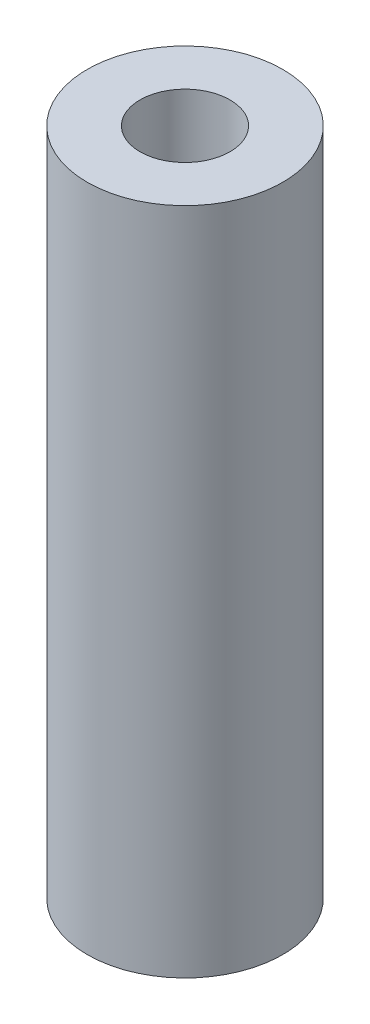
ISO-10303-21;
HEADER;
FILE_DESCRIPTION(('STEP AP214'),'2;1');
FILE_NAME('part.step','',(''),(''),'','','');
FILE_SCHEMA(('AUTOMOTIVE_DESIGN { 1 0 10303 214 1 1 1 1 }'));
ENDSEC;
DATA;
#1=APPLICATION_CONTEXT('core data for automotive mechanical design processes');
#2=APPLICATION_PROTOCOL_DEFINITION('international standard','automotive_design',2000,#1);
#3=PRODUCT_CONTEXT('',#1,'mechanical');
#4=PRODUCT('Part','Part','',(#3));
#5=PRODUCT_RELATED_PRODUCT_CATEGORY('part','',(#4));
#6=PRODUCT_DEFINITION_FORMATION('','',#4);
#7=PRODUCT_DEFINITION_CONTEXT('part definition',#1,'design');
#8=PRODUCT_DEFINITION('design','',#6,#7);
#9=PRODUCT_DEFINITION_SHAPE('','',#8);
#10=(LENGTH_UNIT() NAMED_UNIT(*) SI_UNIT(.MILLI.,.METRE.));
#11=(NAMED_UNIT(*) PLANE_ANGLE_UNIT() SI_UNIT($,.RADIAN.));
#12=(NAMED_UNIT(*) SI_UNIT($,.STERADIAN.) SOLID_ANGLE_UNIT());
#13=UNCERTAINTY_MEASURE_WITH_UNIT(LENGTH_MEASURE(1.E-05),#10,'distance_accuracy_value','');
#14=(GEOMETRIC_REPRESENTATION_CONTEXT(3) GLOBAL_UNCERTAINTY_ASSIGNED_CONTEXT((#13)) GLOBAL_UNIT_ASSIGNED_CONTEXT((#10,
#11,#12)) REPRESENTATION_CONTEXT('',''));
#15=CARTESIAN_POINT('',(0.,0.,0.));
#16=DIRECTION('',(0.,0.,1.));
#17=DIRECTION('',(1.,0.,0.));
#18=AXIS2_PLACEMENT_3D('',#15,#16,#17);
#19=CARTESIAN_POINT('',(0.,34.2,0.));
#20=DIRECTION('',(0.,1.,0.));
#21=DIRECTION('',(0.,0.,1.));
#22=AXIS2_PLACEMENT_3D('',#19,#20,#21);
#23=PLANE('',#22);
#24=CARTESIAN_POINT('',(0.,34.2,0.));
#25=DIRECTION('',(0.,1.,0.));
#26=DIRECTION('',(0.,0.,1.));
#27=AXIS2_PLACEMENT_3D('',#24,#25,#26);
#28=CIRCLE('',#27,5.);
#29=CARTESIAN_POINT('',(0.,34.2,5.));
#30=VERTEX_POINT('',#29);
#31=EDGE_CURVE('E10',#30,#30,#28,.T.);
#32=ORIENTED_EDGE('',*,*,#31,.T.);
#33=EDGE_LOOP('',(#32));
#34=FACE_BOUND('',#33,.T.);
#35=CARTESIAN_POINT('',(0.,34.2,0.));
#36=DIRECTION('',(0.,1.,0.));
#37=DIRECTION('',(0.,0.,1.));
#38=AXIS2_PLACEMENT_3D('',#35,#36,#37);
#39=CIRCLE('',#38,2.3);
#40=CARTESIAN_POINT('',(0.,34.2,2.3));
#41=VERTEX_POINT('',#40);
#42=EDGE_CURVE('E44',#41,#41,#39,.T.);
#43=ORIENTED_EDGE('',*,*,#42,.F.);
#44=EDGE_LOOP('',(#43));
#45=FACE_BOUND('',#44,.T.);
#46=ADVANCED_FACE('F33',(#34,#45),#23,.T.);
#47=CARTESIAN_POINT('',(0.,0.,0.));
#48=DIRECTION('',(0.,1.,0.));
#49=DIRECTION('',(0.,0.,1.));
#50=AXIS2_PLACEMENT_3D('',#47,#48,#49);
#51=PLANE('',#50);
#52=CARTESIAN_POINT('',(0.,0.,0.));
#53=DIRECTION('',(0.,1.,0.));
#54=DIRECTION('',(0.,0.,1.));
#55=AXIS2_PLACEMENT_3D('',#52,#53,#54);
#56=CIRCLE('',#55,5.);
#57=CARTESIAN_POINT('',(0.,0.,5.));
#58=VERTEX_POINT('',#57);
#59=EDGE_CURVE('E37',#58,#58,#56,.T.);
#60=ORIENTED_EDGE('',*,*,#59,.F.);
#61=EDGE_LOOP('',(#60));
#62=FACE_BOUND('',#61,.T.);
#63=CARTESIAN_POINT('',(0.,0.,0.));
#64=DIRECTION('',(0.,1.,0.));
#65=DIRECTION('',(0.,0.,1.));
#66=AXIS2_PLACEMENT_3D('',#63,#64,#65);
#67=CIRCLE('',#66,2.3);
#68=CARTESIAN_POINT('',(0.,0.,2.3));
#69=VERTEX_POINT('',#68);
#70=EDGE_CURVE('E46',#69,#69,#67,.T.);
#71=ORIENTED_EDGE('',*,*,#70,.T.);
#72=EDGE_LOOP('',(#71));
#73=FACE_BOUND('',#72,.T.);
#74=ADVANCED_FACE('F56',(#62,#73),#51,.F.);
#75=CARTESIAN_POINT('',(0.,34.2,0.));
#76=DIRECTION('',(0.,-1.,0.));
#77=DIRECTION('',(0.,0.,-1.));
#78=AXIS2_PLACEMENT_3D('',#75,#76,#77);
#79=CYLINDRICAL_SURFACE('',#78,5.);
#80=ORIENTED_EDGE('',*,*,#31,.F.);
#81=EDGE_LOOP('',(#80));
#82=FACE_BOUND('',#81,.T.);
#83=ORIENTED_EDGE('',*,*,#59,.T.);
#84=EDGE_LOOP('',(#83));
#85=FACE_BOUND('',#84,.T.);
#86=ADVANCED_FACE('F35',(#82,#85),#79,.T.);
#87=CARTESIAN_POINT('',(0.,34.2,0.));
#88=DIRECTION('',(0.,-1.,0.));
#89=DIRECTION('',(0.,0.,-1.));
#90=AXIS2_PLACEMENT_3D('',#87,#88,#89);
#91=CYLINDRICAL_SURFACE('',#90,2.3);
#92=ORIENTED_EDGE('',*,*,#42,.T.);
#93=EDGE_LOOP('',(#92));
#94=FACE_BOUND('',#93,.T.);
#95=ORIENTED_EDGE('',*,*,#70,.F.);
#96=EDGE_LOOP('',(#95));
#97=FACE_BOUND('',#96,.T.);
#98=ADVANCED_FACE('F52',(#94,#97),#91,.F.);
#99=CLOSED_SHELL('',(#46,#74,#86,#98));
#100=MANIFOLD_SOLID_BREP('B2',#99);
#101=ADVANCED_BREP_SHAPE_REPRESENTATION('',(#18,#100),#14);
#102=SHAPE_DEFINITION_REPRESENTATION(#9,#101);
ENDSEC;
END-ISO-10303-21;
